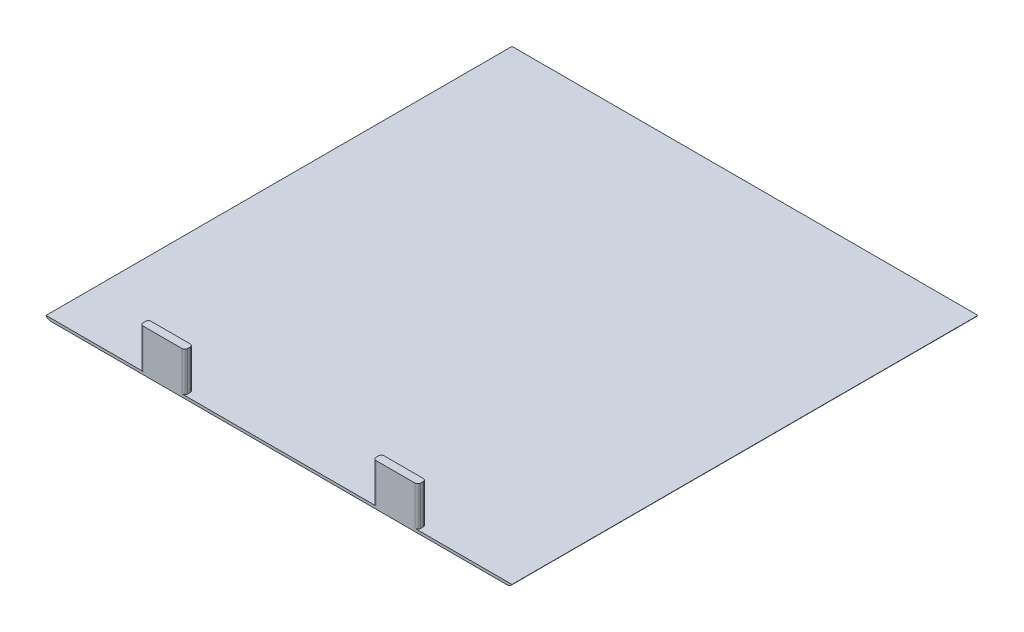
ISO-10303-21;
HEADER;
FILE_DESCRIPTION(('STEP AP214'),'2;1');
FILE_NAME('part.step','',(''),(''),'','','');
FILE_SCHEMA(('AUTOMOTIVE_DESIGN { 1 0 10303 214 1 1 1 1 }'));
ENDSEC;
DATA;
#1=APPLICATION_CONTEXT('core data for automotive mechanical design processes');
#2=APPLICATION_PROTOCOL_DEFINITION('international standard','automotive_design',2000,#1);
#3=PRODUCT_CONTEXT('',#1,'mechanical');
#4=PRODUCT('Part','Part','',(#3));
#5=PRODUCT_RELATED_PRODUCT_CATEGORY('part','',(#4));
#6=PRODUCT_DEFINITION_FORMATION('','',#4);
#7=PRODUCT_DEFINITION_CONTEXT('part definition',#1,'design');
#8=PRODUCT_DEFINITION('design','',#6,#7);
#9=PRODUCT_DEFINITION_SHAPE('','',#8);
#10=(LENGTH_UNIT() NAMED_UNIT(*) SI_UNIT(.MILLI.,.METRE.));
#11=(NAMED_UNIT(*) PLANE_ANGLE_UNIT() SI_UNIT($,.RADIAN.));
#12=(NAMED_UNIT(*) SI_UNIT($,.STERADIAN.) SOLID_ANGLE_UNIT());
#13=UNCERTAINTY_MEASURE_WITH_UNIT(LENGTH_MEASURE(1.E-05),#10,'distance_accuracy_value','');
#14=(GEOMETRIC_REPRESENTATION_CONTEXT(3) GLOBAL_UNCERTAINTY_ASSIGNED_CONTEXT((#13)) GLOBAL_UNIT_ASSIGNED_CONTEXT((#10,
#11,#12)) REPRESENTATION_CONTEXT('',''));
#15=CARTESIAN_POINT('',(0.,0.,0.));
#16=DIRECTION('',(0.,0.,1.));
#17=DIRECTION('',(1.,0.,0.));
#18=AXIS2_PLACEMENT_3D('',#15,#16,#17);
#19=CARTESIAN_POINT('',(0.,0.,0.));
#20=DIRECTION('',(0.,1.,0.));
#21=DIRECTION('',(0.,0.,1.));
#22=AXIS2_PLACEMENT_3D('',#19,#20,#21);
#23=PLANE('',#22);
#24=DIRECTION('',(-1.,0.,0.));
#25=VECTOR('',#24,1.);
#26=CARTESIAN_POINT('',(0.,0.,-103.210295474388));
#27=LINE('',#26,#25);
#28=CARTESIAN_POINT('',(-103.210295474388,0.,-103.210295474388));
#29=VERTEX_POINT('',#28);
#30=CARTESIAN_POINT('',(103.210295474388,0.,-103.210295474388));
#31=VERTEX_POINT('',#30);
#32=EDGE_CURVE('E392',#29,#31,#27,.F.);
#33=ORIENTED_EDGE('',*,*,#32,.T.);
#34=DIRECTION('',(0.,0.,-1.));
#35=VECTOR('',#34,1.);
#36=CARTESIAN_POINT('',(103.210295474388,0.,0.));
#37=LINE('',#36,#35);
#38=CARTESIAN_POINT('',(103.210295474388,0.,105.41));
#39=VERTEX_POINT('',#38);
#40=EDGE_CURVE('E394',#31,#39,#37,.F.);
#41=ORIENTED_EDGE('',*,*,#40,.T.);
#42=DIRECTION('',(1.,0.,0.));
#43=VECTOR('',#42,1.);
#44=CARTESIAN_POINT('',(-105.41,0.,105.41));
#45=LINE('',#44,#43);
#46=CARTESIAN_POINT('',(-103.210295474387,0.,105.41));
#47=VERTEX_POINT('',#46);
#48=EDGE_CURVE('E376',#47,#39,#45,.T.);
#49=ORIENTED_EDGE('',*,*,#48,.F.);
#50=DIRECTION('',(0.,0.,1.));
#51=VECTOR('',#50,1.);
#52=CARTESIAN_POINT('',(-103.210295474388,0.,0.));
#53=LINE('',#52,#51);
#54=EDGE_CURVE('E387',#47,#29,#53,.F.);
#55=ORIENTED_EDGE('',*,*,#54,.T.);
#56=EDGE_LOOP('',(#33,#41,#49,#55));
#57=FACE_BOUND('',#56,.T.);
#58=DIRECTION('',(1.,0.,0.));
#59=VECTOR('',#58,1.);
#60=CARTESIAN_POINT('',(-102.87,0.,-102.87));
#61=LINE('',#60,#59);
#62=CARTESIAN_POINT('',(-102.87,0.,-102.87));
#63=VERTEX_POINT('',#62);
#64=CARTESIAN_POINT('',(102.87,0.,-102.87));
#65=VERTEX_POINT('',#64);
#66=EDGE_CURVE('E222',#63,#65,#61,.T.);
#67=ORIENTED_EDGE('',*,*,#66,.F.);
#68=DIRECTION('',(0.,0.,-1.));
#69=VECTOR('',#68,1.);
#70=CARTESIAN_POINT('',(-102.87,0.,102.87));
#71=LINE('',#70,#69);
#72=CARTESIAN_POINT('',(-102.87,0.,102.87));
#73=VERTEX_POINT('',#72);
#74=EDGE_CURVE('E257',#73,#63,#71,.T.);
#75=ORIENTED_EDGE('',*,*,#74,.F.);
#76=DIRECTION('',(-1.,0.,0.));
#77=VECTOR('',#76,1.);
#78=CARTESIAN_POINT('',(102.87,0.,102.87));
#79=LINE('',#78,#77);
#80=CARTESIAN_POINT('',(102.87,0.,102.87));
#81=VERTEX_POINT('',#80);
#82=EDGE_CURVE('E254',#81,#73,#79,.T.);
#83=ORIENTED_EDGE('',*,*,#82,.F.);
#84=DIRECTION('',(0.,0.,1.));
#85=VECTOR('',#84,1.);
#86=CARTESIAN_POINT('',(102.87,0.,-102.87));
#87=LINE('',#86,#85);
#88=EDGE_CURVE('E251',#65,#81,#87,.T.);
#89=ORIENTED_EDGE('',*,*,#88,.F.);
#90=EDGE_LOOP('',(#67,#75,#83,#89));
#91=FACE_BOUND('',#90,.T.);
#92=ADVANCED_FACE('F40',(#57,#91),#23,.F.);
#93=CARTESIAN_POINT('',(0.,1.27,0.));
#94=DIRECTION('',(0.,1.,0.));
#95=DIRECTION('',(0.,0.,1.));
#96=AXIS2_PLACEMENT_3D('',#93,#94,#95);
#97=PLANE('',#96);
#98=DIRECTION('',(1.,0.,0.));
#99=VECTOR('',#98,1.);
#100=CARTESIAN_POINT('',(-105.41,1.27,105.41));
#101=LINE('',#100,#99);
#102=CARTESIAN_POINT('',(-43.8785,1.27,105.41));
#103=VERTEX_POINT('',#102);
#104=CARTESIAN_POINT('',(43.8785,1.27,105.41));
#105=VERTEX_POINT('',#104);
#106=EDGE_CURVE('E388',#103,#105,#101,.T.);
#107=ORIENTED_EDGE('',*,*,#106,.T.);
#108=CARTESIAN_POINT('',(43.8785,1.27,104.14));
#109=DIRECTION('',(0.,1.,0.));
#110=DIRECTION('',(0.,0.,-1.));
#111=AXIS2_PLACEMENT_3D('',#108,#109,#110);
#112=CIRCLE('',#111,1.27);
#113=CARTESIAN_POINT('',(42.6085,1.27,104.14));
#114=VERTEX_POINT('',#113);
#115=EDGE_CURVE('E292',#114,#105,#112,.T.);
#116=ORIENTED_EDGE('',*,*,#115,.F.);
#117=DIRECTION('',(0.,0.,1.));
#118=VECTOR('',#117,1.);
#119=CARTESIAN_POINT('',(42.6085,1.27,102.997));
#120=LINE('',#119,#118);
#121=CARTESIAN_POINT('',(42.6085,1.27,102.997));
#122=VERTEX_POINT('',#121);
#123=EDGE_CURVE('E294',#122,#114,#120,.T.);
#124=ORIENTED_EDGE('',*,*,#123,.F.);
#125=CARTESIAN_POINT('',(43.8785,1.27,102.997));
#126=DIRECTION('',(0.,1.,0.));
#127=DIRECTION('',(0.,0.,1.));
#128=AXIS2_PLACEMENT_3D('',#125,#126,#127);
#129=CIRCLE('',#128,1.27);
#130=CARTESIAN_POINT('',(43.8785,1.27,101.727));
#131=VERTEX_POINT('',#130);
#132=EDGE_CURVE('E296',#131,#122,#129,.T.);
#133=ORIENTED_EDGE('',*,*,#132,.F.);
#134=DIRECTION('',(-1.,0.,0.));
#135=VECTOR('',#134,1.);
#136=CARTESIAN_POINT('',(61.5315,1.27,101.727));
#137=LINE('',#136,#135);
#138=CARTESIAN_POINT('',(61.5315,1.27,101.727));
#139=VERTEX_POINT('',#138);
#140=EDGE_CURVE('E282',#139,#131,#137,.T.);
#141=ORIENTED_EDGE('',*,*,#140,.F.);
#142=CARTESIAN_POINT('',(61.5315,1.27,102.997));
#143=DIRECTION('',(0.,1.,0.));
#144=DIRECTION('',(0.,0.,-1.));
#145=AXIS2_PLACEMENT_3D('',#142,#143,#144);
#146=CIRCLE('',#145,1.27);
#147=CARTESIAN_POINT('',(62.8015,1.27,102.997));
#148=VERTEX_POINT('',#147);
#149=EDGE_CURVE('E284',#148,#139,#146,.T.);
#150=ORIENTED_EDGE('',*,*,#149,.F.);
#151=DIRECTION('',(0.,0.,-1.));
#152=VECTOR('',#151,1.);
#153=CARTESIAN_POINT('',(62.8015,1.27,102.997));
#154=LINE('',#153,#152);
#155=CARTESIAN_POINT('',(62.8015,1.27,104.14));
#156=VERTEX_POINT('',#155);
#157=EDGE_CURVE('E288',#156,#148,#154,.T.);
#158=ORIENTED_EDGE('',*,*,#157,.F.);
#159=CARTESIAN_POINT('',(61.5315,1.27,104.14));
#160=DIRECTION('',(0.,1.,0.));
#161=DIRECTION('',(0.,0.,-1.));
#162=AXIS2_PLACEMENT_3D('',#159,#160,#161);
#163=CIRCLE('',#162,1.27);
#164=CARTESIAN_POINT('',(61.5315,1.27,105.41));
#165=VERTEX_POINT('',#164);
#166=EDGE_CURVE('E290',#165,#156,#163,.T.);
#167=ORIENTED_EDGE('',*,*,#166,.F.);
#168=CARTESIAN_POINT('',(105.41,1.27,105.41));
#169=VERTEX_POINT('',#168);
#170=EDGE_CURVE('E384',#165,#169,#101,.T.);
#171=ORIENTED_EDGE('',*,*,#170,.T.);
#172=DIRECTION('',(0.,0.,-1.));
#173=VECTOR('',#172,1.);
#174=CARTESIAN_POINT('',(105.41,1.27,-105.41));
#175=LINE('',#174,#173);
#176=CARTESIAN_POINT('',(105.41,1.27,-105.41));
#177=VERTEX_POINT('',#176);
#178=EDGE_CURVE('E377',#169,#177,#175,.T.);
#179=ORIENTED_EDGE('',*,*,#178,.T.);
#180=DIRECTION('',(-1.,0.,0.));
#181=VECTOR('',#180,1.);
#182=CARTESIAN_POINT('',(-105.41,1.27,-105.41));
#183=LINE('',#182,#181);
#184=CARTESIAN_POINT('',(-105.41,1.27,-105.41));
#185=VERTEX_POINT('',#184);
#186=EDGE_CURVE('E380',#177,#185,#183,.T.);
#187=ORIENTED_EDGE('',*,*,#186,.T.);
#188=DIRECTION('',(0.,0.,1.));
#189=VECTOR('',#188,1.);
#190=CARTESIAN_POINT('',(-105.41,1.27,-105.41));
#191=LINE('',#190,#189);
#192=CARTESIAN_POINT('',(-105.41,1.27,105.41));
#193=VERTEX_POINT('',#192);
#194=EDGE_CURVE('E382',#185,#193,#191,.T.);
#195=ORIENTED_EDGE('',*,*,#194,.T.);
#196=CARTESIAN_POINT('',(-61.5315,1.27,105.41));
#197=VERTEX_POINT('',#196);
#198=EDGE_CURVE('E385',#193,#197,#101,.T.);
#199=ORIENTED_EDGE('',*,*,#198,.T.);
#200=CARTESIAN_POINT('',(-61.5315,1.27,104.14));
#201=DIRECTION('',(0.,1.,0.));
#202=DIRECTION('',(0.,0.,1.));
#203=AXIS2_PLACEMENT_3D('',#200,#201,#202);
#204=CIRCLE('',#203,1.27);
#205=CARTESIAN_POINT('',(-62.8015,1.27,104.14));
#206=VERTEX_POINT('',#205);
#207=EDGE_CURVE('E345',#206,#197,#204,.T.);
#208=ORIENTED_EDGE('',*,*,#207,.F.);
#209=DIRECTION('',(0.,0.,1.));
#210=VECTOR('',#209,1.);
#211=CARTESIAN_POINT('',(-62.8015,1.27,102.997));
#212=LINE('',#211,#210);
#213=CARTESIAN_POINT('',(-62.8015,1.27,102.997));
#214=VERTEX_POINT('',#213);
#215=EDGE_CURVE('E342',#214,#206,#212,.T.);
#216=ORIENTED_EDGE('',*,*,#215,.F.);
#217=CARTESIAN_POINT('',(-61.5315,1.27,102.997));
#218=DIRECTION('',(0.,1.,0.));
#219=DIRECTION('',(0.,0.,1.));
#220=AXIS2_PLACEMENT_3D('',#217,#218,#219);
#221=CIRCLE('',#220,1.27);
#222=CARTESIAN_POINT('',(-61.5315,1.27,101.727));
#223=VERTEX_POINT('',#222);
#224=EDGE_CURVE('E339',#223,#214,#221,.T.);
#225=ORIENTED_EDGE('',*,*,#224,.F.);
#226=DIRECTION('',(-1.,0.,0.));
#227=VECTOR('',#226,1.);
#228=CARTESIAN_POINT('',(-61.5315,1.27,101.727));
#229=LINE('',#228,#227);
#230=CARTESIAN_POINT('',(-43.8785,1.27,101.727));
#231=VERTEX_POINT('',#230);
#232=EDGE_CURVE('E336',#231,#223,#229,.T.);
#233=ORIENTED_EDGE('',*,*,#232,.F.);
#234=CARTESIAN_POINT('',(-43.8785,1.27,102.997));
#235=DIRECTION('',(0.,1.,0.));
#236=DIRECTION('',(0.,0.,-1.));
#237=AXIS2_PLACEMENT_3D('',#234,#235,#236);
#238=CIRCLE('',#237,1.27);
#239=CARTESIAN_POINT('',(-42.6085,1.27,102.997));
#240=VERTEX_POINT('',#239);
#241=EDGE_CURVE('E299',#240,#231,#238,.T.);
#242=ORIENTED_EDGE('',*,*,#241,.F.);
#243=DIRECTION('',(0.,0.,-1.));
#244=VECTOR('',#243,1.);
#245=CARTESIAN_POINT('',(-42.6085,1.27,102.997));
#246=LINE('',#245,#244);
#247=CARTESIAN_POINT('',(-42.6085,1.27,104.14));
#248=VERTEX_POINT('',#247);
#249=EDGE_CURVE('E319',#248,#240,#246,.T.);
#250=ORIENTED_EDGE('',*,*,#249,.F.);
#251=CARTESIAN_POINT('',(-43.8785,1.27,104.14));
#252=DIRECTION('',(0.,1.,0.));
#253=DIRECTION('',(0.,0.,1.));
#254=AXIS2_PLACEMENT_3D('',#251,#252,#253);
#255=CIRCLE('',#254,1.27);
#256=EDGE_CURVE('E348',#103,#248,#255,.T.);
#257=ORIENTED_EDGE('',*,*,#256,.F.);
#258=EDGE_LOOP('',(#107,#116,#124,#133,#141,#150,#158,#167,#171,#179,#187,#195,#199,#208,#216,
#225,#233,#242,#250,#257));
#259=FACE_BOUND('',#258,.T.);
#260=ADVANCED_FACE('F433',(#259),#97,.T.);
#261=CARTESIAN_POINT('',(-105.41,1.27,105.41));
#262=DIRECTION('',(0.,0.,-1.));
#263=DIRECTION('',(-1.,0.,0.));
#264=AXIS2_PLACEMENT_3D('',#261,#262,#263);
#265=PLANE('',#264);
#266=ORIENTED_EDGE('',*,*,#48,.T.);
#267=CARTESIAN_POINT('',(103.210295474388,2.54,105.41));
#268=DIRECTION('',(0.,0.,-1.));
#269=DIRECTION('',(-1.,0.,0.));
#270=AXIS2_PLACEMENT_3D('',#267,#268,#269);
#271=CIRCLE('',#270,2.54);
#272=EDGE_CURVE('E398',#39,#169,#271,.F.);
#273=ORIENTED_EDGE('',*,*,#272,.T.);
#274=ORIENTED_EDGE('',*,*,#170,.F.);
#275=DIRECTION('',(0.,-1.,0.));
#276=VECTOR('',#275,1.);
#277=CARTESIAN_POINT('',(61.5315,19.05,105.41));
#278=LINE('',#277,#276);
#279=CARTESIAN_POINT('',(61.5315,19.05,105.41));
#280=VERTEX_POINT('',#279);
#281=EDGE_CURVE('E268',#280,#165,#278,.T.);
#282=ORIENTED_EDGE('',*,*,#281,.F.);
#283=DIRECTION('',(1.,0.,0.));
#284=VECTOR('',#283,1.);
#285=CARTESIAN_POINT('',(61.5315,19.05,105.41));
#286=LINE('',#285,#284);
#287=CARTESIAN_POINT('',(43.8785,19.05,105.41));
#288=VERTEX_POINT('',#287);
#289=EDGE_CURVE('E307',#288,#280,#286,.T.);
#290=ORIENTED_EDGE('',*,*,#289,.F.);
#291=DIRECTION('',(0.,-1.,0.));
#292=VECTOR('',#291,1.);
#293=CARTESIAN_POINT('',(43.8785,19.05,105.41));
#294=LINE('',#293,#292);
#295=EDGE_CURVE('E265',#288,#105,#294,.T.);
#296=ORIENTED_EDGE('',*,*,#295,.T.);
#297=ORIENTED_EDGE('',*,*,#106,.F.);
#298=DIRECTION('',(0.,-1.,0.));
#299=VECTOR('',#298,1.);
#300=CARTESIAN_POINT('',(-43.8785,19.05,105.41));
#301=LINE('',#300,#299);
#302=CARTESIAN_POINT('',(-43.8785,19.05,105.41));
#303=VERTEX_POINT('',#302);
#304=EDGE_CURVE('E358',#303,#103,#301,.T.);
#305=ORIENTED_EDGE('',*,*,#304,.F.);
#306=DIRECTION('',(1.,0.,0.));
#307=VECTOR('',#306,1.);
#308=CARTESIAN_POINT('',(-61.5315,19.05,105.41));
#309=LINE('',#308,#307);
#310=CARTESIAN_POINT('',(-61.5315,19.05,105.41));
#311=VERTEX_POINT('',#310);
#312=EDGE_CURVE('E327',#311,#303,#309,.T.);
#313=ORIENTED_EDGE('',*,*,#312,.F.);
#314=DIRECTION('',(0.,-1.,0.));
#315=VECTOR('',#314,1.);
#316=CARTESIAN_POINT('',(-61.5315,19.05,105.41));
#317=LINE('',#316,#315);
#318=EDGE_CURVE('E361',#311,#197,#317,.T.);
#319=ORIENTED_EDGE('',*,*,#318,.T.);
#320=ORIENTED_EDGE('',*,*,#198,.F.);
#321=CARTESIAN_POINT('',(-103.210295474387,2.54,105.41));
#322=DIRECTION('',(0.,0.,-1.));
#323=DIRECTION('',(-1.,0.,0.));
#324=AXIS2_PLACEMENT_3D('',#321,#322,#323);
#325=CIRCLE('',#324,2.54);
#326=EDGE_CURVE('E396',#193,#47,#325,.F.);
#327=ORIENTED_EDGE('',*,*,#326,.T.);
#328=EDGE_LOOP('',(#266,#273,#274,#282,#290,#296,#297,#305,#313,#319,#320,#327));
#329=FACE_BOUND('',#328,.T.);
#330=ADVANCED_FACE('F439',(#329),#265,.F.);
#331=CARTESIAN_POINT('',(-43.8785,19.05,102.997));
#332=DIRECTION('',(0.,-1.,0.));
#333=DIRECTION('',(0.,0.,-1.));
#334=AXIS2_PLACEMENT_3D('',#331,#332,#333);
#335=CYLINDRICAL_SURFACE('',#334,1.27);
#336=ORIENTED_EDGE('',*,*,#241,.T.);
#337=DIRECTION('',(0.,-1.,0.));
#338=VECTOR('',#337,1.);
#339=CARTESIAN_POINT('',(-43.8785,19.05,101.727));
#340=LINE('',#339,#338);
#341=CARTESIAN_POINT('',(-43.8785,19.05,101.727));
#342=VERTEX_POINT('',#341);
#343=EDGE_CURVE('E373',#342,#231,#340,.T.);
#344=ORIENTED_EDGE('',*,*,#343,.F.);
#345=CARTESIAN_POINT('',(-43.8785,19.05,102.997));
#346=DIRECTION('',(0.,1.,0.));
#347=DIRECTION('',(0.,0.,-1.));
#348=AXIS2_PLACEMENT_3D('',#345,#346,#347);
#349=CIRCLE('',#348,1.27);
#350=CARTESIAN_POINT('',(-42.6085,19.05,102.997));
#351=VERTEX_POINT('',#350);
#352=EDGE_CURVE('E315',#351,#342,#349,.T.);
#353=ORIENTED_EDGE('',*,*,#352,.F.);
#354=DIRECTION('',(0.,-1.,0.));
#355=VECTOR('',#354,1.);
#356=CARTESIAN_POINT('',(-42.6085,19.05,102.997));
#357=LINE('',#356,#355);
#358=EDGE_CURVE('E333',#351,#240,#357,.T.);
#359=ORIENTED_EDGE('',*,*,#358,.T.);
#360=EDGE_LOOP('',(#336,#344,#353,#359));
#361=FACE_BOUND('',#360,.T.);
#362=ADVANCED_FACE('F524',(#361),#335,.T.);
#363=CARTESIAN_POINT('',(-61.5315,19.05,101.727));
#364=DIRECTION('',(0.,0.,1.));
#365=DIRECTION('',(1.,0.,0.));
#366=AXIS2_PLACEMENT_3D('',#363,#364,#365);
#367=PLANE('',#366);
#368=ORIENTED_EDGE('',*,*,#232,.T.);
#369=DIRECTION('',(0.,-1.,0.));
#370=VECTOR('',#369,1.);
#371=CARTESIAN_POINT('',(-61.5315,19.05,101.727));
#372=LINE('',#371,#370);
#373=CARTESIAN_POINT('',(-61.5315,19.05,101.727));
#374=VERTEX_POINT('',#373);
#375=EDGE_CURVE('E370',#374,#223,#372,.T.);
#376=ORIENTED_EDGE('',*,*,#375,.F.);
#377=DIRECTION('',(-1.,0.,0.));
#378=VECTOR('',#377,1.);
#379=CARTESIAN_POINT('',(-61.5315,19.05,101.727));
#380=LINE('',#379,#378);
#381=EDGE_CURVE('E318',#342,#374,#380,.T.);
#382=ORIENTED_EDGE('',*,*,#381,.F.);
#383=ORIENTED_EDGE('',*,*,#343,.T.);
#384=EDGE_LOOP('',(#368,#376,#382,#383));
#385=FACE_BOUND('',#384,.T.);
#386=ADVANCED_FACE('F520',(#385),#367,.F.);
#387=CARTESIAN_POINT('',(-61.5315,19.05,102.997));
#388=DIRECTION('',(0.,-1.,0.));
#389=DIRECTION('',(0.,0.,-1.));
#390=AXIS2_PLACEMENT_3D('',#387,#388,#389);
#391=CYLINDRICAL_SURFACE('',#390,1.27);
#392=ORIENTED_EDGE('',*,*,#224,.T.);
#393=DIRECTION('',(0.,-1.,0.));
#394=VECTOR('',#393,1.);
#395=CARTESIAN_POINT('',(-62.8015,19.05,102.997));
#396=LINE('',#395,#394);
#397=CARTESIAN_POINT('',(-62.8015,19.05,102.997));
#398=VERTEX_POINT('',#397);
#399=EDGE_CURVE('E367',#398,#214,#396,.T.);
#400=ORIENTED_EDGE('',*,*,#399,.F.);
#401=CARTESIAN_POINT('',(-61.5315,19.05,102.997));
#402=DIRECTION('',(0.,1.,0.));
#403=DIRECTION('',(0.,0.,1.));
#404=AXIS2_PLACEMENT_3D('',#401,#402,#403);
#405=CIRCLE('',#404,1.27);
#406=EDGE_CURVE('E321',#374,#398,#405,.T.);
#407=ORIENTED_EDGE('',*,*,#406,.F.);
#408=ORIENTED_EDGE('',*,*,#375,.T.);
#409=EDGE_LOOP('',(#392,#400,#407,#408));
#410=FACE_BOUND('',#409,.T.);
#411=ADVANCED_FACE('F516',(#410),#391,.T.);
#412=CARTESIAN_POINT('',(-62.8015,19.05,102.997));
#413=DIRECTION('',(1.,0.,0.));
#414=DIRECTION('',(0.,0.,-1.));
#415=AXIS2_PLACEMENT_3D('',#412,#413,#414);
#416=PLANE('',#415);
#417=ORIENTED_EDGE('',*,*,#215,.T.);
#418=DIRECTION('',(0.,-1.,0.));
#419=VECTOR('',#418,1.);
#420=CARTESIAN_POINT('',(-62.8015,19.05,104.14));
#421=LINE('',#420,#419);
#422=CARTESIAN_POINT('',(-62.8015,19.05,104.14));
#423=VERTEX_POINT('',#422);
#424=EDGE_CURVE('E364',#423,#206,#421,.T.);
#425=ORIENTED_EDGE('',*,*,#424,.F.);
#426=DIRECTION('',(0.,0.,1.));
#427=VECTOR('',#426,1.);
#428=CARTESIAN_POINT('',(-62.8015,19.05,102.997));
#429=LINE('',#428,#427);
#430=EDGE_CURVE('E323',#398,#423,#429,.T.);
#431=ORIENTED_EDGE('',*,*,#430,.F.);
#432=ORIENTED_EDGE('',*,*,#399,.T.);
#433=EDGE_LOOP('',(#417,#425,#431,#432));
#434=FACE_BOUND('',#433,.T.);
#435=ADVANCED_FACE('F512',(#434),#416,.F.);
#436=CARTESIAN_POINT('',(-61.5315,19.05,104.14));
#437=DIRECTION('',(0.,-1.,0.));
#438=DIRECTION('',(0.,0.,-1.));
#439=AXIS2_PLACEMENT_3D('',#436,#437,#438);
#440=CYLINDRICAL_SURFACE('',#439,1.27);
#441=ORIENTED_EDGE('',*,*,#207,.T.);
#442=ORIENTED_EDGE('',*,*,#318,.F.);
#443=CARTESIAN_POINT('',(-61.5315,19.05,104.14));
#444=DIRECTION('',(0.,1.,0.));
#445=DIRECTION('',(0.,0.,1.));
#446=AXIS2_PLACEMENT_3D('',#443,#444,#445);
#447=CIRCLE('',#446,1.27);
#448=EDGE_CURVE('E325',#423,#311,#447,.T.);
#449=ORIENTED_EDGE('',*,*,#448,.F.);
#450=ORIENTED_EDGE('',*,*,#424,.T.);
#451=EDGE_LOOP('',(#441,#442,#449,#450));
#452=FACE_BOUND('',#451,.T.);
#453=ADVANCED_FACE('F508',(#452),#440,.T.);
#454=CARTESIAN_POINT('',(-43.8785,19.05,104.14));
#455=DIRECTION('',(0.,-1.,0.));
#456=DIRECTION('',(0.,0.,-1.));
#457=AXIS2_PLACEMENT_3D('',#454,#455,#456);
#458=CYLINDRICAL_SURFACE('',#457,1.27);
#459=ORIENTED_EDGE('',*,*,#256,.T.);
#460=DIRECTION('',(0.,-1.,0.));
#461=VECTOR('',#460,1.);
#462=CARTESIAN_POINT('',(-42.6085,19.05,104.14));
#463=LINE('',#462,#461);
#464=CARTESIAN_POINT('',(-42.6085,19.05,104.14));
#465=VERTEX_POINT('',#464);
#466=EDGE_CURVE('E355',#465,#248,#463,.T.);
#467=ORIENTED_EDGE('',*,*,#466,.F.);
#468=CARTESIAN_POINT('',(-43.8785,19.05,104.14));
#469=DIRECTION('',(0.,1.,0.));
#470=DIRECTION('',(0.,0.,1.));
#471=AXIS2_PLACEMENT_3D('',#468,#469,#470);
#472=CIRCLE('',#471,1.27);
#473=EDGE_CURVE('E329',#303,#465,#472,.T.);
#474=ORIENTED_EDGE('',*,*,#473,.F.);
#475=ORIENTED_EDGE('',*,*,#304,.T.);
#476=EDGE_LOOP('',(#459,#467,#474,#475));
#477=FACE_BOUND('',#476,.T.);
#478=ADVANCED_FACE('F504',(#477),#458,.T.);
#479=CARTESIAN_POINT('',(-42.6085,19.05,102.997));
#480=DIRECTION('',(-1.,0.,0.));
#481=DIRECTION('',(0.,0.,1.));
#482=AXIS2_PLACEMENT_3D('',#479,#480,#481);
#483=PLANE('',#482);
#484=ORIENTED_EDGE('',*,*,#249,.T.);
#485=ORIENTED_EDGE('',*,*,#358,.F.);
#486=DIRECTION('',(0.,0.,-1.));
#487=VECTOR('',#486,1.);
#488=CARTESIAN_POINT('',(-42.6085,19.05,102.997));
#489=LINE('',#488,#487);
#490=EDGE_CURVE('E331',#465,#351,#489,.T.);
#491=ORIENTED_EDGE('',*,*,#490,.F.);
#492=ORIENTED_EDGE('',*,*,#466,.T.);
#493=EDGE_LOOP('',(#484,#485,#491,#492));
#494=FACE_BOUND('',#493,.T.);
#495=ADVANCED_FACE('F500',(#494),#483,.F.);
#496=CARTESIAN_POINT('',(-43.8785,19.05,102.997));
#497=DIRECTION('',(0.,-1.,0.));
#498=DIRECTION('',(0.,0.,-1.));
#499=AXIS2_PLACEMENT_3D('',#496,#497,#498);
#500=PLANE('',#499);
#501=ORIENTED_EDGE('',*,*,#352,.T.);
#502=ORIENTED_EDGE('',*,*,#381,.T.);
#503=ORIENTED_EDGE('',*,*,#406,.T.);
#504=ORIENTED_EDGE('',*,*,#430,.T.);
#505=ORIENTED_EDGE('',*,*,#448,.T.);
#506=ORIENTED_EDGE('',*,*,#312,.T.);
#507=ORIENTED_EDGE('',*,*,#473,.T.);
#508=ORIENTED_EDGE('',*,*,#490,.T.);
#509=EDGE_LOOP('',(#501,#502,#503,#504,#505,#506,#507,#508));
#510=FACE_BOUND('',#509,.T.);
#511=ADVANCED_FACE('F470',(#510),#500,.F.);
#512=CARTESIAN_POINT('',(43.8785,19.05,102.997));
#513=DIRECTION('',(0.,-1.,0.));
#514=DIRECTION('',(0.,0.,-1.));
#515=AXIS2_PLACEMENT_3D('',#512,#513,#514);
#516=CYLINDRICAL_SURFACE('',#515,1.27);
#517=ORIENTED_EDGE('',*,*,#132,.T.);
#518=DIRECTION('',(0.,-1.,0.));
#519=VECTOR('',#518,1.);
#520=CARTESIAN_POINT('',(42.6085,19.05,102.997));
#521=LINE('',#520,#519);
#522=CARTESIAN_POINT('',(42.6085,19.05,102.997));
#523=VERTEX_POINT('',#522);
#524=EDGE_CURVE('E260',#523,#122,#521,.T.);
#525=ORIENTED_EDGE('',*,*,#524,.F.);
#526=CARTESIAN_POINT('',(43.8785,19.05,102.997));
#527=DIRECTION('',(0.,1.,0.));
#528=DIRECTION('',(0.,0.,1.));
#529=AXIS2_PLACEMENT_3D('',#526,#527,#528);
#530=CIRCLE('',#529,1.27);
#531=CARTESIAN_POINT('',(43.8785,19.05,101.727));
#532=VERTEX_POINT('',#531);
#533=EDGE_CURVE('E285',#532,#523,#530,.T.);
#534=ORIENTED_EDGE('',*,*,#533,.F.);
#535=DIRECTION('',(0.,-1.,0.));
#536=VECTOR('',#535,1.);
#537=CARTESIAN_POINT('',(43.8785,19.05,101.727));
#538=LINE('',#537,#536);
#539=EDGE_CURVE('E278',#532,#131,#538,.T.);
#540=ORIENTED_EDGE('',*,*,#539,.T.);
#541=EDGE_LOOP('',(#517,#525,#534,#540));
#542=FACE_BOUND('',#541,.T.);
#543=ADVANCED_FACE('F466',(#542),#516,.T.);
#544=CARTESIAN_POINT('',(42.6085,19.05,102.997));
#545=DIRECTION('',(1.,0.,0.));
#546=DIRECTION('',(0.,0.,-1.));
#547=AXIS2_PLACEMENT_3D('',#544,#545,#546);
#548=PLANE('',#547);
#549=ORIENTED_EDGE('',*,*,#123,.T.);
#550=DIRECTION('',(0.,-1.,0.));
#551=VECTOR('',#550,1.);
#552=CARTESIAN_POINT('',(42.6085,19.05,104.14));
#553=LINE('',#552,#551);
#554=CARTESIAN_POINT('',(42.6085,19.05,104.14));
#555=VERTEX_POINT('',#554);
#556=EDGE_CURVE('E262',#555,#114,#553,.T.);
#557=ORIENTED_EDGE('',*,*,#556,.F.);
#558=DIRECTION('',(0.,0.,1.));
#559=VECTOR('',#558,1.);
#560=CARTESIAN_POINT('',(42.6085,19.05,102.997));
#561=LINE('',#560,#559);
#562=EDGE_CURVE('E311',#523,#555,#561,.T.);
#563=ORIENTED_EDGE('',*,*,#562,.F.);
#564=ORIENTED_EDGE('',*,*,#524,.T.);
#565=EDGE_LOOP('',(#549,#557,#563,#564));
#566=FACE_BOUND('',#565,.T.);
#567=ADVANCED_FACE('F469',(#566),#548,.F.);
#568=CARTESIAN_POINT('',(43.8785,19.05,104.14));
#569=DIRECTION('',(0.,-1.,0.));
#570=DIRECTION('',(0.,0.,-1.));
#571=AXIS2_PLACEMENT_3D('',#568,#569,#570);
#572=CYLINDRICAL_SURFACE('',#571,1.27);
#573=ORIENTED_EDGE('',*,*,#115,.T.);
#574=ORIENTED_EDGE('',*,*,#295,.F.);
#575=CARTESIAN_POINT('',(43.8785,19.05,104.14));
#576=DIRECTION('',(0.,1.,0.));
#577=DIRECTION('',(0.,0.,-1.));
#578=AXIS2_PLACEMENT_3D('',#575,#576,#577);
#579=CIRCLE('',#578,1.27);
#580=EDGE_CURVE('E309',#555,#288,#579,.T.);
#581=ORIENTED_EDGE('',*,*,#580,.F.);
#582=ORIENTED_EDGE('',*,*,#556,.T.);
#583=EDGE_LOOP('',(#573,#574,#581,#582));
#584=FACE_BOUND('',#583,.T.);
#585=ADVANCED_FACE('F474',(#584),#572,.T.);
#586=CARTESIAN_POINT('',(61.5315,19.05,104.14));
#587=DIRECTION('',(0.,-1.,0.));
#588=DIRECTION('',(0.,0.,-1.));
#589=AXIS2_PLACEMENT_3D('',#586,#587,#588);
#590=CYLINDRICAL_SURFACE('',#589,1.27);
#591=ORIENTED_EDGE('',*,*,#166,.T.);
#592=DIRECTION('',(0.,-1.,0.));
#593=VECTOR('',#592,1.);
#594=CARTESIAN_POINT('',(62.8015,19.05,104.14));
#595=LINE('',#594,#593);
#596=CARTESIAN_POINT('',(62.8015,19.05,104.14));
#597=VERTEX_POINT('',#596);
#598=EDGE_CURVE('E270',#597,#156,#595,.T.);
#599=ORIENTED_EDGE('',*,*,#598,.F.);
#600=CARTESIAN_POINT('',(61.5315,19.05,104.14));
#601=DIRECTION('',(0.,1.,0.));
#602=DIRECTION('',(0.,0.,-1.));
#603=AXIS2_PLACEMENT_3D('',#600,#601,#602);
#604=CIRCLE('',#603,1.27);
#605=EDGE_CURVE('E305',#280,#597,#604,.T.);
#606=ORIENTED_EDGE('',*,*,#605,.F.);
#607=ORIENTED_EDGE('',*,*,#281,.T.);
#608=EDGE_LOOP('',(#591,#599,#606,#607));
#609=FACE_BOUND('',#608,.T.);
#610=ADVANCED_FACE('F478',(#609),#590,.T.);
#611=CARTESIAN_POINT('',(62.8015,19.05,102.997));
#612=DIRECTION('',(-1.,0.,0.));
#613=DIRECTION('',(0.,0.,1.));
#614=AXIS2_PLACEMENT_3D('',#611,#612,#613);
#615=PLANE('',#614);
#616=ORIENTED_EDGE('',*,*,#157,.T.);
#617=DIRECTION('',(0.,-1.,0.));
#618=VECTOR('',#617,1.);
#619=CARTESIAN_POINT('',(62.8015,19.05,102.997));
#620=LINE('',#619,#618);
#621=CARTESIAN_POINT('',(62.8015,19.05,102.997));
#622=VERTEX_POINT('',#621);
#623=EDGE_CURVE('E273',#622,#148,#620,.T.);
#624=ORIENTED_EDGE('',*,*,#623,.F.);
#625=DIRECTION('',(0.,0.,-1.));
#626=VECTOR('',#625,1.);
#627=CARTESIAN_POINT('',(62.8015,19.05,102.997));
#628=LINE('',#627,#626);
#629=EDGE_CURVE('E303',#597,#622,#628,.T.);
#630=ORIENTED_EDGE('',*,*,#629,.F.);
#631=ORIENTED_EDGE('',*,*,#598,.T.);
#632=EDGE_LOOP('',(#616,#624,#630,#631));
#633=FACE_BOUND('',#632,.T.);
#634=ADVANCED_FACE('F482',(#633),#615,.F.);
#635=CARTESIAN_POINT('',(61.5315,19.05,102.997));
#636=DIRECTION('',(0.,-1.,0.));
#637=DIRECTION('',(0.,0.,-1.));
#638=AXIS2_PLACEMENT_3D('',#635,#636,#637);
#639=CYLINDRICAL_SURFACE('',#638,1.27);
#640=ORIENTED_EDGE('',*,*,#149,.T.);
#641=DIRECTION('',(0.,-1.,0.));
#642=VECTOR('',#641,1.);
#643=CARTESIAN_POINT('',(61.5315,19.05,101.727));
#644=LINE('',#643,#642);
#645=CARTESIAN_POINT('',(61.5315,19.05,101.727));
#646=VERTEX_POINT('',#645);
#647=EDGE_CURVE('E276',#646,#139,#644,.T.);
#648=ORIENTED_EDGE('',*,*,#647,.F.);
#649=CARTESIAN_POINT('',(61.5315,19.05,102.997));
#650=DIRECTION('',(0.,1.,0.));
#651=DIRECTION('',(0.,0.,-1.));
#652=AXIS2_PLACEMENT_3D('',#649,#650,#651);
#653=CIRCLE('',#652,1.27);
#654=EDGE_CURVE('E301',#622,#646,#653,.T.);
#655=ORIENTED_EDGE('',*,*,#654,.F.);
#656=ORIENTED_EDGE('',*,*,#623,.T.);
#657=EDGE_LOOP('',(#640,#648,#655,#656));
#658=FACE_BOUND('',#657,.T.);
#659=ADVANCED_FACE('F486',(#658),#639,.T.);
#660=CARTESIAN_POINT('',(61.5315,19.05,101.727));
#661=DIRECTION('',(0.,0.,1.));
#662=DIRECTION('',(1.,0.,0.));
#663=AXIS2_PLACEMENT_3D('',#660,#661,#662);
#664=PLANE('',#663);
#665=ORIENTED_EDGE('',*,*,#140,.T.);
#666=ORIENTED_EDGE('',*,*,#539,.F.);
#667=DIRECTION('',(-1.,0.,0.));
#668=VECTOR('',#667,1.);
#669=CARTESIAN_POINT('',(61.5315,19.05,101.727));
#670=LINE('',#669,#668);
#671=EDGE_CURVE('E281',#646,#532,#670,.T.);
#672=ORIENTED_EDGE('',*,*,#671,.F.);
#673=ORIENTED_EDGE('',*,*,#647,.T.);
#674=EDGE_LOOP('',(#665,#666,#672,#673));
#675=FACE_BOUND('',#674,.T.);
#676=ADVANCED_FACE('F490',(#675),#664,.F.);
#677=CARTESIAN_POINT('',(43.8785,19.05,102.997));
#678=DIRECTION('',(0.,1.,0.));
#679=DIRECTION('',(0.,0.,1.));
#680=AXIS2_PLACEMENT_3D('',#677,#678,#679);
#681=PLANE('',#680);
#682=ORIENTED_EDGE('',*,*,#533,.T.);
#683=ORIENTED_EDGE('',*,*,#562,.T.);
#684=ORIENTED_EDGE('',*,*,#580,.T.);
#685=ORIENTED_EDGE('',*,*,#289,.T.);
#686=ORIENTED_EDGE('',*,*,#605,.T.);
#687=ORIENTED_EDGE('',*,*,#629,.T.);
#688=ORIENTED_EDGE('',*,*,#654,.T.);
#689=ORIENTED_EDGE('',*,*,#671,.T.);
#690=EDGE_LOOP('',(#682,#683,#684,#685,#686,#687,#688,#689));
#691=FACE_BOUND('',#690,.T.);
#692=ADVANCED_FACE('F465',(#691),#681,.T.);
#693=CARTESIAN_POINT('',(101.6,-0.508,101.6));
#694=DIRECTION('',(0.,0.,-1.));
#695=DIRECTION('',(-1.,0.,0.));
#696=AXIS2_PLACEMENT_3D('',#693,#694,#695);
#697=PLANE('',#696);
#698=DIRECTION('',(0.,1.,0.));
#699=VECTOR('',#698,1.);
#700=CARTESIAN_POINT('',(101.6,-0.508,101.6));
#701=LINE('',#700,#699);
#702=CARTESIAN_POINT('',(101.6,-0.495268090250815,101.6));
#703=VERTEX_POINT('',#702);
#704=CARTESIAN_POINT('',(101.6,0.,101.6));
#705=VERTEX_POINT('',#704);
#706=EDGE_CURVE('E244',#703,#705,#701,.T.);
#707=ORIENTED_EDGE('',*,*,#706,.F.);
#708=DIRECTION('',(1.,0.,0.));
#709=VECTOR('',#708,1.);
#710=CARTESIAN_POINT('',(0.,-0.495268090250815,101.6));
#711=LINE('',#710,#709);
#712=CARTESIAN_POINT('',(-101.6,-0.495268090250815,101.6));
#713=VERTEX_POINT('',#712);
#714=EDGE_CURVE('E221',#703,#713,#711,.F.);
#715=ORIENTED_EDGE('',*,*,#714,.T.);
#716=DIRECTION('',(0.,1.,0.));
#717=VECTOR('',#716,1.);
#718=CARTESIAN_POINT('',(-101.6,-0.508,101.6));
#719=LINE('',#718,#717);
#720=CARTESIAN_POINT('',(-101.6,0.,101.6));
#721=VERTEX_POINT('',#720);
#722=EDGE_CURVE('E213',#713,#721,#719,.T.);
#723=ORIENTED_EDGE('',*,*,#722,.T.);
#724=DIRECTION('',(-1.,0.,0.));
#725=VECTOR('',#724,1.);
#726=CARTESIAN_POINT('',(101.6,0.,101.6));
#727=LINE('',#726,#725);
#728=EDGE_CURVE('E218',#705,#721,#727,.T.);
#729=ORIENTED_EDGE('',*,*,#728,.F.);
#730=EDGE_LOOP('',(#707,#715,#723,#729));
#731=FACE_BOUND('',#730,.T.);
#732=ADVANCED_FACE('F216',(#731),#697,.T.);
#733=CARTESIAN_POINT('',(-101.6,-0.508,101.6));
#734=DIRECTION('',(1.,0.,0.));
#735=DIRECTION('',(0.,0.,-1.));
#736=AXIS2_PLACEMENT_3D('',#733,#734,#735);
#737=PLANE('',#736);
#738=ORIENTED_EDGE('',*,*,#722,.F.);
#739=DIRECTION('',(0.,0.,1.));
#740=VECTOR('',#739,1.);
#741=CARTESIAN_POINT('',(-101.6,-0.495268090250815,0.));
#742=LINE('',#741,#740);
#743=CARTESIAN_POINT('',(-101.6,-0.495268090250815,-101.6));
#744=VERTEX_POINT('',#743);
#745=EDGE_CURVE('E11',#713,#744,#742,.F.);
#746=ORIENTED_EDGE('',*,*,#745,.T.);
#747=DIRECTION('',(0.,1.,0.));
#748=VECTOR('',#747,1.);
#749=CARTESIAN_POINT('',(-101.6,-0.508,-101.6));
#750=LINE('',#749,#748);
#751=CARTESIAN_POINT('',(-101.6,0.,-101.6));
#752=VERTEX_POINT('',#751);
#753=EDGE_CURVE('E223',#744,#752,#750,.T.);
#754=ORIENTED_EDGE('',*,*,#753,.T.);
#755=DIRECTION('',(0.,0.,-1.));
#756=VECTOR('',#755,1.);
#757=CARTESIAN_POINT('',(-101.6,0.,101.6));
#758=LINE('',#757,#756);
#759=EDGE_CURVE('E226',#721,#752,#758,.T.);
#760=ORIENTED_EDGE('',*,*,#759,.F.);
#761=EDGE_LOOP('',(#738,#746,#754,#760));
#762=FACE_BOUND('',#761,.T.);
#763=ADVANCED_FACE('F227',(#762),#737,.T.);
#764=CARTESIAN_POINT('',(-101.6,-0.508,-101.6));
#765=DIRECTION('',(0.,0.,1.));
#766=DIRECTION('',(1.,0.,0.));
#767=AXIS2_PLACEMENT_3D('',#764,#765,#766);
#768=PLANE('',#767);
#769=ORIENTED_EDGE('',*,*,#753,.F.);
#770=DIRECTION('',(-1.,0.,0.));
#771=VECTOR('',#770,1.);
#772=CARTESIAN_POINT('',(0.508000000000008,-0.495268090250815,-101.6));
#773=LINE('',#772,#771);
#774=CARTESIAN_POINT('',(101.6,-0.495268090250815,-101.6));
#775=VERTEX_POINT('',#774);
#776=EDGE_CURVE('E49',#744,#775,#773,.F.);
#777=ORIENTED_EDGE('',*,*,#776,.T.);
#778=DIRECTION('',(0.,1.,0.));
#779=VECTOR('',#778,1.);
#780=CARTESIAN_POINT('',(101.6,-0.508,-101.6));
#781=LINE('',#780,#779);
#782=CARTESIAN_POINT('',(101.6,0.,-101.6));
#783=VERTEX_POINT('',#782);
#784=EDGE_CURVE('E246',#775,#783,#781,.T.);
#785=ORIENTED_EDGE('',*,*,#784,.T.);
#786=DIRECTION('',(1.,0.,0.));
#787=VECTOR('',#786,1.);
#788=CARTESIAN_POINT('',(-101.6,0.,-101.6));
#789=LINE('',#788,#787);
#790=EDGE_CURVE('E231',#752,#783,#789,.T.);
#791=ORIENTED_EDGE('',*,*,#790,.F.);
#792=EDGE_LOOP('',(#769,#777,#785,#791));
#793=FACE_BOUND('',#792,.T.);
#794=ADVANCED_FACE('F453',(#793),#768,.T.);
#795=CARTESIAN_POINT('',(101.6,-0.508,-101.6));
#796=DIRECTION('',(-1.,0.,0.));
#797=DIRECTION('',(0.,0.,1.));
#798=AXIS2_PLACEMENT_3D('',#795,#796,#797);
#799=PLANE('',#798);
#800=ORIENTED_EDGE('',*,*,#784,.F.);
#801=DIRECTION('',(0.,0.,-1.));
#802=VECTOR('',#801,1.);
#803=CARTESIAN_POINT('',(101.6,-0.495268090250815,0.508000000000008));
#804=LINE('',#803,#802);
#805=EDGE_CURVE('E402',#775,#703,#804,.F.);
#806=ORIENTED_EDGE('',*,*,#805,.T.);
#807=ORIENTED_EDGE('',*,*,#706,.T.);
#808=DIRECTION('',(0.,0.,1.));
#809=VECTOR('',#808,1.);
#810=CARTESIAN_POINT('',(101.6,0.,-101.6));
#811=LINE('',#810,#809);
#812=EDGE_CURVE('E235',#783,#705,#811,.T.);
#813=ORIENTED_EDGE('',*,*,#812,.F.);
#814=EDGE_LOOP('',(#800,#806,#807,#813));
#815=FACE_BOUND('',#814,.T.);
#816=ADVANCED_FACE('F445',(#815),#799,.T.);
#817=ORIENTED_EDGE('',*,*,#812,.T.);
#818=ORIENTED_EDGE('',*,*,#728,.T.);
#819=ORIENTED_EDGE('',*,*,#759,.T.);
#820=ORIENTED_EDGE('',*,*,#790,.T.);
#821=EDGE_LOOP('',(#817,#818,#819,#820));
#822=FACE_BOUND('',#821,.T.);
#823=ADVANCED_FACE('F233',(#822),#23,.F.);
#824=CARTESIAN_POINT('',(-103.210295474388,2.54,-105.41));
#825=DIRECTION('',(0.,0.,1.));
#826=DIRECTION('',(1.,0.,0.));
#827=AXIS2_PLACEMENT_3D('',#824,#825,#826);
#828=CYLINDRICAL_SURFACE('',#827,2.54);
#829=ORIENTED_EDGE('',*,*,#326,.F.);
#830=ORIENTED_EDGE('',*,*,#194,.F.);
#831=CARTESIAN_POINT('',(-103.210295474388,2.54,-103.210295474388));
#832=DIRECTION('',(-0.707106781186547,0.,0.707106781186548));
#833=DIRECTION('',(0.707106781186548,0.,0.707106781186547));
#834=AXIS2_PLACEMENT_3D('',#831,#832,#833);
#835=ELLIPSE('',#834,3.59210244842766,2.54);
#836=EDGE_CURVE('E236',#29,#185,#835,.F.);
#837=ORIENTED_EDGE('',*,*,#836,.F.);
#838=ORIENTED_EDGE('',*,*,#54,.F.);
#839=EDGE_LOOP('',(#829,#830,#837,#838));
#840=FACE_BOUND('',#839,.T.);
#841=ADVANCED_FACE('F444',(#840),#828,.T.);
#842=CARTESIAN_POINT('',(-105.41,2.54,-103.210295474388));
#843=DIRECTION('',(-1.,0.,0.));
#844=DIRECTION('',(0.,0.,1.));
#845=AXIS2_PLACEMENT_3D('',#842,#843,#844);
#846=CYLINDRICAL_SURFACE('',#845,2.54);
#847=ORIENTED_EDGE('',*,*,#836,.T.);
#848=ORIENTED_EDGE('',*,*,#186,.F.);
#849=CARTESIAN_POINT('',(103.210295474388,2.54,-103.210295474388));
#850=DIRECTION('',(-0.707106781186547,0.,-0.707106781186547));
#851=DIRECTION('',(-0.707106781186547,0.,0.707106781186548));
#852=AXIS2_PLACEMENT_3D('',#849,#850,#851);
#853=ELLIPSE('',#852,3.59210244842766,2.54);
#854=EDGE_CURVE('E239',#31,#177,#853,.F.);
#855=ORIENTED_EDGE('',*,*,#854,.F.);
#856=ORIENTED_EDGE('',*,*,#32,.F.);
#857=EDGE_LOOP('',(#847,#848,#855,#856));
#858=FACE_BOUND('',#857,.T.);
#859=ADVANCED_FACE('F450',(#858),#846,.T.);
#860=CARTESIAN_POINT('',(103.210295474388,2.54,-105.41));
#861=DIRECTION('',(0.,0.,-1.));
#862=DIRECTION('',(-1.,0.,0.));
#863=AXIS2_PLACEMENT_3D('',#860,#861,#862);
#864=CYLINDRICAL_SURFACE('',#863,2.54);
#865=ORIENTED_EDGE('',*,*,#272,.F.);
#866=ORIENTED_EDGE('',*,*,#40,.F.);
#867=ORIENTED_EDGE('',*,*,#854,.T.);
#868=ORIENTED_EDGE('',*,*,#178,.F.);
#869=EDGE_LOOP('',(#865,#866,#867,#868));
#870=FACE_BOUND('',#869,.T.);
#871=ADVANCED_FACE('F553',(#870),#864,.T.);
#872=CARTESIAN_POINT('',(-102.87,2.032,-101.346));
#873=DIRECTION('',(-1.,0.,0.));
#874=DIRECTION('',(0.,0.,1.));
#875=AXIS2_PLACEMENT_3D('',#872,#873,#874);
#876=CYLINDRICAL_SURFACE('',#875,2.54);
#877=CARTESIAN_POINT('',(-101.346,2.032,-101.346));
#878=DIRECTION('',(-0.707106781186547,0.,0.707106781186548));
#879=DIRECTION('',(0.707106781186548,0.,0.707106781186547));
#880=AXIS2_PLACEMENT_3D('',#877,#878,#879);
#881=ELLIPSE('',#880,3.59210244842766,2.54);
#882=EDGE_CURVE('E408',#63,#744,#881,.T.);
#883=ORIENTED_EDGE('',*,*,#882,.F.);
#884=ORIENTED_EDGE('',*,*,#66,.T.);
#885=CARTESIAN_POINT('',(101.346,2.032,-101.346));
#886=DIRECTION('',(-0.707106781186547,0.,-0.707106781186547));
#887=DIRECTION('',(-0.707106781186547,0.,0.707106781186548));
#888=AXIS2_PLACEMENT_3D('',#885,#886,#887);
#889=ELLIPSE('',#888,3.59210244842766,2.54);
#890=EDGE_CURVE('E44',#775,#65,#889,.F.);
#891=ORIENTED_EDGE('',*,*,#890,.F.);
#892=ORIENTED_EDGE('',*,*,#776,.F.);
#893=EDGE_LOOP('',(#883,#884,#891,#892));
#894=FACE_BOUND('',#893,.T.);
#895=ADVANCED_FACE('F42',(#894),#876,.T.);
#896=CARTESIAN_POINT('',(101.346,2.032,-102.87));
#897=DIRECTION('',(0.,0.,-1.));
#898=DIRECTION('',(-1.,0.,0.));
#899=AXIS2_PLACEMENT_3D('',#896,#897,#898);
#900=CYLINDRICAL_SURFACE('',#899,2.54);
#901=ORIENTED_EDGE('',*,*,#890,.T.);
#902=ORIENTED_EDGE('',*,*,#88,.T.);
#903=CARTESIAN_POINT('',(101.346,2.032,101.346));
#904=DIRECTION('',(0.707106781186547,0.,-0.707106781186548));
#905=DIRECTION('',(-0.707106781186547,0.,-0.707106781186547));
#906=AXIS2_PLACEMENT_3D('',#903,#904,#905);
#907=ELLIPSE('',#906,3.59210244842766,2.54);
#908=EDGE_CURVE('E407',#703,#81,#907,.F.);
#909=ORIENTED_EDGE('',*,*,#908,.F.);
#910=ORIENTED_EDGE('',*,*,#805,.F.);
#911=EDGE_LOOP('',(#901,#902,#909,#910));
#912=FACE_BOUND('',#911,.T.);
#913=ADVANCED_FACE('F416',(#912),#900,.T.);
#914=CARTESIAN_POINT('',(-101.346,2.032,102.87));
#915=DIRECTION('',(0.,0.,1.));
#916=DIRECTION('',(1.,0.,0.));
#917=AXIS2_PLACEMENT_3D('',#914,#915,#916);
#918=CYLINDRICAL_SURFACE('',#917,2.54);
#919=ORIENTED_EDGE('',*,*,#882,.T.);
#920=ORIENTED_EDGE('',*,*,#745,.F.);
#921=CARTESIAN_POINT('',(-101.346,2.032,101.346));
#922=DIRECTION('',(0.707106781186548,0.,0.707106781186547));
#923=DIRECTION('',(-0.707106781186547,0.,0.707106781186548));
#924=AXIS2_PLACEMENT_3D('',#921,#922,#923);
#925=ELLIPSE('',#924,3.59210244842766,2.54);
#926=EDGE_CURVE('E405',#73,#713,#925,.T.);
#927=ORIENTED_EDGE('',*,*,#926,.F.);
#928=ORIENTED_EDGE('',*,*,#74,.T.);
#929=EDGE_LOOP('',(#919,#920,#927,#928));
#930=FACE_BOUND('',#929,.T.);
#931=ADVANCED_FACE('F424',(#930),#918,.T.);
#932=CARTESIAN_POINT('',(102.87,2.032,101.346));
#933=DIRECTION('',(1.,0.,0.));
#934=DIRECTION('',(0.,0.,-1.));
#935=AXIS2_PLACEMENT_3D('',#932,#933,#934);
#936=CYLINDRICAL_SURFACE('',#935,2.54);
#937=ORIENTED_EDGE('',*,*,#908,.T.);
#938=ORIENTED_EDGE('',*,*,#82,.T.);
#939=ORIENTED_EDGE('',*,*,#926,.T.);
#940=ORIENTED_EDGE('',*,*,#714,.F.);
#941=EDGE_LOOP('',(#937,#938,#939,#940));
#942=FACE_BOUND('',#941,.T.);
#943=ADVANCED_FACE('F423',(#942),#936,.T.);
#944=CLOSED_SHELL('',(#92,#260,#330,#362,#386,#411,#435,#453,#478,#495,#511,#543,#567,#585,#610,
#634,#659,#676,#692,#732,#763,#794,#816,#823,#841,#859,#871,#895,#913,#931,#943));
#945=MANIFOLD_SOLID_BREP('B2',#944);
#946=ADVANCED_BREP_SHAPE_REPRESENTATION('',(#18,#945),#14);
#947=SHAPE_DEFINITION_REPRESENTATION(#9,#946);
ENDSEC;
END-ISO-10303-21;
